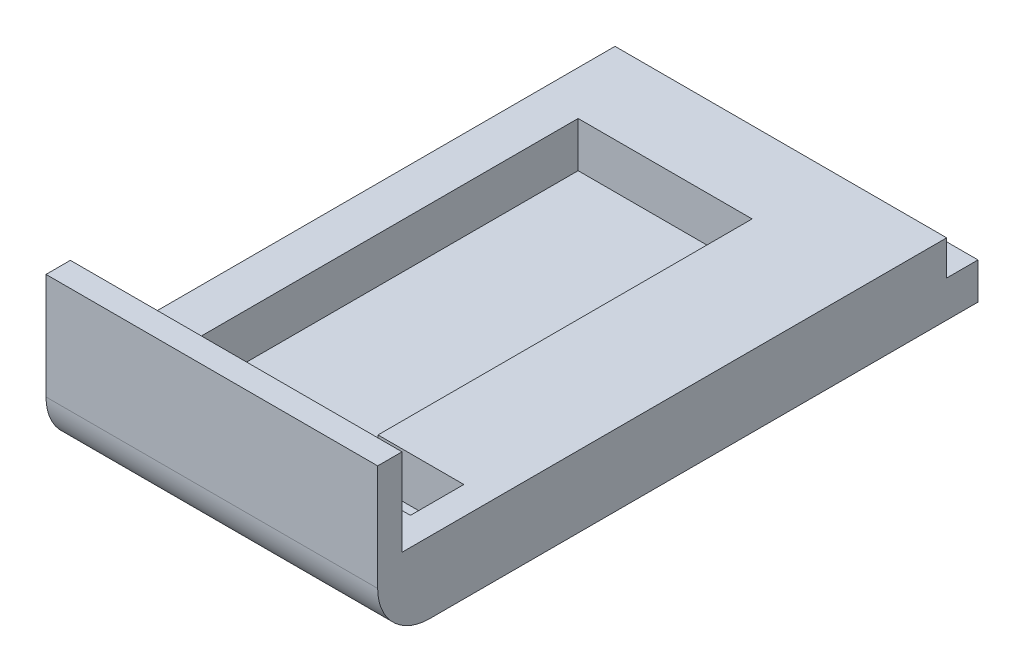
ISO-10303-21;
HEADER;
FILE_DESCRIPTION(('STEP AP214'),'2;1');
FILE_NAME('part.step','',(''),(''),'','','');
FILE_SCHEMA(('AUTOMOTIVE_DESIGN { 1 0 10303 214 1 1 1 1 }'));
ENDSEC;
DATA;
#1=APPLICATION_CONTEXT('core data for automotive mechanical design processes');
#2=APPLICATION_PROTOCOL_DEFINITION('international standard','automotive_design',2000,#1);
#3=PRODUCT_CONTEXT('',#1,'mechanical');
#4=PRODUCT('Part','Part','',(#3));
#5=PRODUCT_RELATED_PRODUCT_CATEGORY('part','',(#4));
#6=PRODUCT_DEFINITION_FORMATION('','',#4);
#7=PRODUCT_DEFINITION_CONTEXT('part definition',#1,'design');
#8=PRODUCT_DEFINITION('design','',#6,#7);
#9=PRODUCT_DEFINITION_SHAPE('','',#8);
#10=(LENGTH_UNIT() NAMED_UNIT(*) SI_UNIT(.MILLI.,.METRE.));
#11=(NAMED_UNIT(*) PLANE_ANGLE_UNIT() SI_UNIT($,.RADIAN.));
#12=(NAMED_UNIT(*) SI_UNIT($,.STERADIAN.) SOLID_ANGLE_UNIT());
#13=UNCERTAINTY_MEASURE_WITH_UNIT(LENGTH_MEASURE(1.E-05),#10,'distance_accuracy_value','');
#14=(GEOMETRIC_REPRESENTATION_CONTEXT(3) GLOBAL_UNCERTAINTY_ASSIGNED_CONTEXT((#13)) GLOBAL_UNIT_ASSIGNED_CONTEXT((#10,
#11,#12)) REPRESENTATION_CONTEXT('',''));
#15=CARTESIAN_POINT('',(0.,0.,0.));
#16=DIRECTION('',(0.,0.,1.));
#17=DIRECTION('',(1.,0.,0.));
#18=AXIS2_PLACEMENT_3D('',#15,#16,#17);
#19=CARTESIAN_POINT('',(19.06,0.,-34.5));
#20=DIRECTION('',(0.,-1.,0.));
#21=DIRECTION('',(0.,0.,-1.));
#22=AXIS2_PLACEMENT_3D('',#19,#20,#21);
#23=PLANE('',#22);
#24=DIRECTION('',(1.,0.,0.));
#25=VECTOR('',#24,1.);
#26=CARTESIAN_POINT('',(2.53,0.,-4.05));
#27=LINE('',#26,#25);
#28=CARTESIAN_POINT('',(2.53,0.,-4.05));
#29=VERTEX_POINT('',#28);
#30=CARTESIAN_POINT('',(11.9779181362568,0.,-4.05));
#31=VERTEX_POINT('',#30);
#32=EDGE_CURVE('E260',#29,#31,#27,.T.);
#33=ORIENTED_EDGE('',*,*,#32,.F.);
#34=DIRECTION('',(0.,0.,1.));
#35=VECTOR('',#34,1.);
#36=CARTESIAN_POINT('',(2.53,0.,-28.05));
#37=LINE('',#36,#35);
#38=CARTESIAN_POINT('',(2.53,0.,-28.05));
#39=VERTEX_POINT('',#38);
#40=EDGE_CURVE('E225',#39,#29,#37,.T.);
#41=ORIENTED_EDGE('',*,*,#40,.F.);
#42=DIRECTION('',(-1.,0.,0.));
#43=VECTOR('',#42,1.);
#44=CARTESIAN_POINT('',(2.53,0.,-28.05));
#45=LINE('',#44,#43);
#46=CARTESIAN_POINT('',(12.53,0.,-28.05));
#47=VERTEX_POINT('',#46);
#48=EDGE_CURVE('E231',#47,#39,#45,.T.);
#49=ORIENTED_EDGE('',*,*,#48,.F.);
#50=DIRECTION('',(0.,0.,-1.));
#51=VECTOR('',#50,1.);
#52=CARTESIAN_POINT('',(12.53,0.,-28.05));
#53=LINE('',#52,#51);
#54=CARTESIAN_POINT('',(12.53,0.,-6.55));
#55=VERTEX_POINT('',#54);
#56=EDGE_CURVE('E280',#55,#47,#53,.T.);
#57=ORIENTED_EDGE('',*,*,#56,.F.);
#58=DIRECTION('',(-1.,0.,0.));
#59=VECTOR('',#58,1.);
#60=CARTESIAN_POINT('',(12.53,0.,-6.55));
#61=LINE('',#60,#59);
#62=CARTESIAN_POINT('',(17.4641994632339,0.,-6.55));
#63=VERTEX_POINT('',#62);
#64=EDGE_CURVE('E276',#63,#55,#61,.T.);
#65=ORIENTED_EDGE('',*,*,#64,.F.);
#66=DIRECTION('',(0.,0.,-1.));
#67=VECTOR('',#66,1.);
#68=CARTESIAN_POINT('',(17.4641994632339,0.,-6.55));
#69=LINE('',#68,#67);
#70=CARTESIAN_POINT('',(17.4641994632339,0.,-3.47901693670788));
#71=VERTEX_POINT('',#70);
#72=EDGE_CURVE('E272',#71,#63,#69,.T.);
#73=ORIENTED_EDGE('',*,*,#72,.F.);
#74=DIRECTION('',(1.,0.,0.));
#75=VECTOR('',#74,1.);
#76=CARTESIAN_POINT('',(12.53,0.,-3.47901693670788));
#77=LINE('',#76,#75);
#78=CARTESIAN_POINT('',(11.9779181362568,0.,-3.47901693670788));
#79=VERTEX_POINT('',#78);
#80=EDGE_CURVE('E268',#79,#71,#77,.T.);
#81=ORIENTED_EDGE('',*,*,#80,.F.);
#82=DIRECTION('',(0.,0.,1.));
#83=VECTOR('',#82,1.);
#84=CARTESIAN_POINT('',(11.9779181362568,0.,-3.47901693670788));
#85=LINE('',#84,#83);
#86=EDGE_CURVE('E264',#31,#79,#85,.T.);
#87=ORIENTED_EDGE('',*,*,#86,.F.);
#88=EDGE_LOOP('',(#33,#41,#49,#57,#65,#73,#81,#87));
#89=FACE_BOUND('',#88,.T.);
#90=DIRECTION('',(0.,0.,1.));
#91=VECTOR('',#90,1.);
#92=CARTESIAN_POINT('',(19.06,0.,-34.5));
#93=LINE('',#92,#91);
#94=CARTESIAN_POINT('',(19.06,0.,-32.7));
#95=VERTEX_POINT('',#94);
#96=CARTESIAN_POINT('',(19.06,0.,-1.40000000000002));
#97=VERTEX_POINT('',#96);
#98=EDGE_CURVE('E310',#95,#97,#93,.T.);
#99=ORIENTED_EDGE('',*,*,#98,.F.);
#100=DIRECTION('',(-1.,0.,0.));
#101=VECTOR('',#100,1.);
#102=CARTESIAN_POINT('',(19.061,0.,-32.7));
#103=LINE('',#102,#101);
#104=CARTESIAN_POINT('',(0.,0.,-32.7));
#105=VERTEX_POINT('',#104);
#106=EDGE_CURVE('E171',#95,#105,#103,.T.);
#107=ORIENTED_EDGE('',*,*,#106,.T.);
#108=DIRECTION('',(0.,0.,1.));
#109=VECTOR('',#108,1.);
#110=CARTESIAN_POINT('',(0.,0.,-34.5));
#111=LINE('',#110,#109);
#112=CARTESIAN_POINT('',(0.,0.,-1.40000000000002));
#113=VERTEX_POINT('',#112);
#114=EDGE_CURVE('E167',#105,#113,#111,.T.);
#115=ORIENTED_EDGE('',*,*,#114,.T.);
#116=DIRECTION('',(1.,0.,0.));
#117=VECTOR('',#116,1.);
#118=CARTESIAN_POINT('',(0.,0.,-1.40000000000002));
#119=LINE('',#118,#117);
#120=EDGE_CURVE('E169',#113,#97,#119,.T.);
#121=ORIENTED_EDGE('',*,*,#120,.T.);
#122=EDGE_LOOP('',(#99,#107,#115,#121));
#123=FACE_BOUND('',#122,.T.);
#124=ADVANCED_FACE('F45',(#89,#123),#23,.F.);
#125=CARTESIAN_POINT('',(19.06,0.,0.));
#126=DIRECTION('',(0.,0.,-1.));
#127=DIRECTION('',(0.,1.,0.));
#128=AXIS2_PLACEMENT_3D('',#125,#126,#127);
#129=PLANE('',#128);
#130=DIRECTION('',(0.,-1.,0.));
#131=VECTOR('',#130,1.);
#132=CARTESIAN_POINT('',(0.,0.,0.));
#133=LINE('',#132,#131);
#134=CARTESIAN_POINT('',(0.,5.,0.));
#135=VERTEX_POINT('',#134);
#136=CARTESIAN_POINT('',(0.,-1.09999999999998,0.));
#137=VERTEX_POINT('',#136);
#138=EDGE_CURVE('E175',#135,#137,#133,.T.);
#139=ORIENTED_EDGE('',*,*,#138,.T.);
#140=DIRECTION('',(-1.,0.,0.));
#141=VECTOR('',#140,1.);
#142=CARTESIAN_POINT('',(19.06,-1.09999999999998,0.));
#143=LINE('',#142,#141);
#144=CARTESIAN_POINT('',(19.06,-1.09999999999998,0.));
#145=VERTEX_POINT('',#144);
#146=EDGE_CURVE('E11',#145,#137,#143,.T.);
#147=ORIENTED_EDGE('',*,*,#146,.F.);
#148=DIRECTION('',(0.,-1.,0.));
#149=VECTOR('',#148,1.);
#150=CARTESIAN_POINT('',(19.06,0.,0.));
#151=LINE('',#150,#149);
#152=CARTESIAN_POINT('',(19.06,5.,0.));
#153=VERTEX_POINT('',#152);
#154=EDGE_CURVE('E313',#153,#145,#151,.T.);
#155=ORIENTED_EDGE('',*,*,#154,.F.);
#156=DIRECTION('',(1.,0.,0.));
#157=VECTOR('',#156,1.);
#158=CARTESIAN_POINT('',(19.06,5.,0.));
#159=LINE('',#158,#157);
#160=EDGE_CURVE('E221',#135,#153,#159,.T.);
#161=ORIENTED_EDGE('',*,*,#160,.F.);
#162=EDGE_LOOP('',(#139,#147,#155,#161));
#163=FACE_BOUND('',#162,.T.);
#164=ADVANCED_FACE('F364',(#163),#129,.F.);
#165=CARTESIAN_POINT('',(19.06,-1.1,-3.));
#166=DIRECTION('',(-1.,0.,0.));
#167=DIRECTION('',(0.,0.,1.));
#168=AXIS2_PLACEMENT_3D('',#165,#166,#167);
#169=CYLINDRICAL_SURFACE('',#168,3.);
#170=CARTESIAN_POINT('',(0.,-1.1,-3.));
#171=DIRECTION('',(1.,0.,0.));
#172=DIRECTION('',(0.,0.,1.));
#173=AXIS2_PLACEMENT_3D('',#170,#171,#172);
#174=CIRCLE('',#173,3.);
#175=CARTESIAN_POINT('',(0.,-4.1,-3.00000000000002));
#176=VERTEX_POINT('',#175);
#177=EDGE_CURVE('E330',#137,#176,#174,.T.);
#178=ORIENTED_EDGE('',*,*,#177,.T.);
#179=DIRECTION('',(-1.,0.,0.));
#180=VECTOR('',#179,1.);
#181=CARTESIAN_POINT('',(19.06,-4.1,-3.00000000000002));
#182=LINE('',#181,#180);
#183=CARTESIAN_POINT('',(19.06,-4.1,-3.00000000000002));
#184=VERTEX_POINT('',#183);
#185=EDGE_CURVE('E53',#184,#176,#182,.T.);
#186=ORIENTED_EDGE('',*,*,#185,.F.);
#187=CARTESIAN_POINT('',(19.06,-1.1,-3.));
#188=DIRECTION('',(1.,0.,0.));
#189=DIRECTION('',(0.,0.,1.));
#190=AXIS2_PLACEMENT_3D('',#187,#188,#189);
#191=CIRCLE('',#190,3.);
#192=EDGE_CURVE('E317',#145,#184,#191,.T.);
#193=ORIENTED_EDGE('',*,*,#192,.F.);
#194=ORIENTED_EDGE('',*,*,#146,.T.);
#195=EDGE_LOOP('',(#178,#186,#193,#194));
#196=FACE_BOUND('',#195,.T.);
#197=ADVANCED_FACE('F362',(#196),#169,.T.);
#198=CARTESIAN_POINT('',(19.06,-4.1,-3.00000000000002));
#199=DIRECTION('',(0.,1.,0.));
#200=DIRECTION('',(0.,0.,1.));
#201=AXIS2_PLACEMENT_3D('',#198,#199,#200);
#202=PLANE('',#201);
#203=DIRECTION('',(0.,0.,-1.));
#204=VECTOR('',#203,1.);
#205=CARTESIAN_POINT('',(0.,-4.1,-3.00000000000002));
#206=LINE('',#205,#204);
#207=CARTESIAN_POINT('',(0.,-4.1,-34.5));
#208=VERTEX_POINT('',#207);
#209=EDGE_CURVE('E333',#176,#208,#206,.T.);
#210=ORIENTED_EDGE('',*,*,#209,.T.);
#211=DIRECTION('',(-1.,0.,0.));
#212=VECTOR('',#211,1.);
#213=CARTESIAN_POINT('',(19.06,-4.1,-34.5));
#214=LINE('',#213,#212);
#215=CARTESIAN_POINT('',(19.06,-4.1,-34.5));
#216=VERTEX_POINT('',#215);
#217=EDGE_CURVE('E326',#216,#208,#214,.T.);
#218=ORIENTED_EDGE('',*,*,#217,.F.);
#219=DIRECTION('',(0.,0.,-1.));
#220=VECTOR('',#219,1.);
#221=CARTESIAN_POINT('',(19.06,-4.1,-3.00000000000002));
#222=LINE('',#221,#220);
#223=EDGE_CURVE('E320',#184,#216,#222,.T.);
#224=ORIENTED_EDGE('',*,*,#223,.F.);
#225=ORIENTED_EDGE('',*,*,#185,.T.);
#226=EDGE_LOOP('',(#210,#218,#224,#225));
#227=FACE_BOUND('',#226,.T.);
#228=ADVANCED_FACE('F347',(#227),#202,.F.);
#229=CARTESIAN_POINT('',(19.06,-4.1,-34.5));
#230=DIRECTION('',(0.,0.,1.));
#231=DIRECTION('',(1.,0.,0.));
#232=AXIS2_PLACEMENT_3D('',#229,#230,#231);
#233=PLANE('',#232);
#234=DIRECTION('',(0.,1.,0.));
#235=VECTOR('',#234,1.);
#236=CARTESIAN_POINT('',(0.,-4.1,-34.5));
#237=LINE('',#236,#235);
#238=CARTESIAN_POINT('',(0.,-2.,-34.5));
#239=VERTEX_POINT('',#238);
#240=EDGE_CURVE('E314',#208,#239,#237,.T.);
#241=ORIENTED_EDGE('',*,*,#240,.T.);
#242=DIRECTION('',(-1.,0.,0.));
#243=VECTOR('',#242,1.);
#244=CARTESIAN_POINT('',(19.061,-2.,-34.5));
#245=LINE('',#244,#243);
#246=CARTESIAN_POINT('',(19.06,-2.,-34.5));
#247=VERTEX_POINT('',#246);
#248=EDGE_CURVE('E68',#247,#239,#245,.T.);
#249=ORIENTED_EDGE('',*,*,#248,.F.);
#250=DIRECTION('',(0.,1.,0.));
#251=VECTOR('',#250,1.);
#252=CARTESIAN_POINT('',(19.06,-4.1,-34.5));
#253=LINE('',#252,#251);
#254=EDGE_CURVE('E323',#216,#247,#253,.T.);
#255=ORIENTED_EDGE('',*,*,#254,.F.);
#256=ORIENTED_EDGE('',*,*,#217,.T.);
#257=EDGE_LOOP('',(#241,#249,#255,#256));
#258=FACE_BOUND('',#257,.T.);
#259=ADVANCED_FACE('F354',(#258),#233,.F.);
#260=CARTESIAN_POINT('',(19.06,-1.1,-3.));
#261=DIRECTION('',(-1.,0.,0.));
#262=DIRECTION('',(0.,0.,1.));
#263=AXIS2_PLACEMENT_3D('',#260,#261,#262);
#264=PLANE('',#263);
#265=ORIENTED_EDGE('',*,*,#98,.T.);
#266=DIRECTION('',(0.,-1.,0.));
#267=VECTOR('',#266,1.);
#268=CARTESIAN_POINT('',(19.06,0.,-1.40000000000002));
#269=LINE('',#268,#267);
#270=CARTESIAN_POINT('',(19.06,5.,-1.40000000000002));
#271=VERTEX_POINT('',#270);
#272=EDGE_CURVE('E180',#271,#97,#269,.T.);
#273=ORIENTED_EDGE('',*,*,#272,.F.);
#274=DIRECTION('',(0.,0.,-1.));
#275=VECTOR('',#274,1.);
#276=CARTESIAN_POINT('',(19.06,5.,-1.90000000000002));
#277=LINE('',#276,#275);
#278=EDGE_CURVE('E215',#153,#271,#277,.T.);
#279=ORIENTED_EDGE('',*,*,#278,.F.);
#280=ORIENTED_EDGE('',*,*,#154,.T.);
#281=ORIENTED_EDGE('',*,*,#192,.T.);
#282=ORIENTED_EDGE('',*,*,#223,.T.);
#283=ORIENTED_EDGE('',*,*,#254,.T.);
#284=DIRECTION('',(0.,0.,-1.));
#285=VECTOR('',#284,1.);
#286=CARTESIAN_POINT('',(19.06,-2.,-34.5));
#287=LINE('',#286,#285);
#288=CARTESIAN_POINT('',(19.06,-2.,-32.7));
#289=VERTEX_POINT('',#288);
#290=EDGE_CURVE('E207',#289,#247,#287,.T.);
#291=ORIENTED_EDGE('',*,*,#290,.F.);
#292=DIRECTION('',(0.,-1.,0.));
#293=VECTOR('',#292,1.);
#294=CARTESIAN_POINT('',(19.06,0.,-32.7));
#295=LINE('',#294,#293);
#296=EDGE_CURVE('E182',#95,#289,#295,.T.);
#297=ORIENTED_EDGE('',*,*,#296,.F.);
#298=EDGE_LOOP('',(#265,#273,#279,#280,#281,#282,#283,#291,#297));
#299=FACE_BOUND('',#298,.T.);
#300=ADVANCED_FACE('F358',(#299),#264,.F.);
#301=CARTESIAN_POINT('',(0.,-1.1,-3.));
#302=DIRECTION('',(-1.,0.,0.));
#303=DIRECTION('',(0.,0.,1.));
#304=AXIS2_PLACEMENT_3D('',#301,#302,#303);
#305=PLANE('',#304);
#306=DIRECTION('',(0.,-1.,0.));
#307=VECTOR('',#306,1.);
#308=CARTESIAN_POINT('',(0.,0.,-1.40000000000002));
#309=LINE('',#308,#307);
#310=CARTESIAN_POINT('',(0.,5.,-1.40000000000002));
#311=VERTEX_POINT('',#310);
#312=EDGE_CURVE('E60',#311,#113,#309,.T.);
#313=ORIENTED_EDGE('',*,*,#312,.T.);
#314=ORIENTED_EDGE('',*,*,#114,.F.);
#315=DIRECTION('',(0.,1.,0.));
#316=VECTOR('',#315,1.);
#317=CARTESIAN_POINT('',(0.,0.,-32.7));
#318=LINE('',#317,#316);
#319=CARTESIAN_POINT('',(0.,-2.,-32.7));
#320=VERTEX_POINT('',#319);
#321=EDGE_CURVE('E202',#320,#105,#318,.T.);
#322=ORIENTED_EDGE('',*,*,#321,.F.);
#323=DIRECTION('',(0.,0.,1.));
#324=VECTOR('',#323,1.);
#325=CARTESIAN_POINT('',(0.,-2.,-34.5));
#326=LINE('',#325,#324);
#327=EDGE_CURVE('E199',#239,#320,#326,.T.);
#328=ORIENTED_EDGE('',*,*,#327,.F.);
#329=ORIENTED_EDGE('',*,*,#240,.F.);
#330=ORIENTED_EDGE('',*,*,#209,.F.);
#331=ORIENTED_EDGE('',*,*,#177,.F.);
#332=ORIENTED_EDGE('',*,*,#138,.F.);
#333=DIRECTION('',(0.,0.,1.));
#334=VECTOR('',#333,1.);
#335=CARTESIAN_POINT('',(0.,5.,-1.90000000000002));
#336=LINE('',#335,#334);
#337=EDGE_CURVE('E188',#311,#135,#336,.T.);
#338=ORIENTED_EDGE('',*,*,#337,.F.);
#339=EDGE_LOOP('',(#313,#314,#322,#328,#329,#330,#331,#332,#338));
#340=FACE_BOUND('',#339,.T.);
#341=ADVANCED_FACE('F186',(#340),#305,.T.);
#342=CARTESIAN_POINT('',(2.53,-2.6,-28.05));
#343=DIRECTION('',(-1.,0.,0.));
#344=DIRECTION('',(0.,0.,1.));
#345=AXIS2_PLACEMENT_3D('',#342,#343,#344);
#346=PLANE('',#345);
#347=ORIENTED_EDGE('',*,*,#40,.T.);
#348=DIRECTION('',(0.,1.,0.));
#349=VECTOR('',#348,1.);
#350=CARTESIAN_POINT('',(2.53,-2.6,-4.05));
#351=LINE('',#350,#349);
#352=CARTESIAN_POINT('',(2.53,-2.6,-4.05));
#353=VERTEX_POINT('',#352);
#354=EDGE_CURVE('E257',#353,#29,#351,.T.);
#355=ORIENTED_EDGE('',*,*,#354,.F.);
#356=DIRECTION('',(0.,0.,1.));
#357=VECTOR('',#356,1.);
#358=CARTESIAN_POINT('',(2.53,-2.6,-28.05));
#359=LINE('',#358,#357);
#360=CARTESIAN_POINT('',(2.53,-2.6,-28.05));
#361=VERTEX_POINT('',#360);
#362=EDGE_CURVE('E226',#361,#353,#359,.T.);
#363=ORIENTED_EDGE('',*,*,#362,.F.);
#364=DIRECTION('',(0.,1.,0.));
#365=VECTOR('',#364,1.);
#366=CARTESIAN_POINT('',(2.53,-2.6,-28.05));
#367=LINE('',#366,#365);
#368=EDGE_CURVE('E176',#361,#39,#367,.T.);
#369=ORIENTED_EDGE('',*,*,#368,.T.);
#370=EDGE_LOOP('',(#347,#355,#363,#369));
#371=FACE_BOUND('',#370,.T.);
#372=ADVANCED_FACE('F397',(#371),#346,.F.);
#373=CARTESIAN_POINT('',(2.53,-2.6,-28.05));
#374=DIRECTION('',(0.,0.,-1.));
#375=DIRECTION('',(-1.,0.,0.));
#376=AXIS2_PLACEMENT_3D('',#373,#374,#375);
#377=PLANE('',#376);
#378=ORIENTED_EDGE('',*,*,#48,.T.);
#379=ORIENTED_EDGE('',*,*,#368,.F.);
#380=DIRECTION('',(-1.,0.,0.));
#381=VECTOR('',#380,1.);
#382=CARTESIAN_POINT('',(2.53,-2.6,-28.05));
#383=LINE('',#382,#381);
#384=CARTESIAN_POINT('',(12.53,-2.6,-28.05));
#385=VERTEX_POINT('',#384);
#386=EDGE_CURVE('E253',#385,#361,#383,.T.);
#387=ORIENTED_EDGE('',*,*,#386,.F.);
#388=DIRECTION('',(0.,1.,0.));
#389=VECTOR('',#388,1.);
#390=CARTESIAN_POINT('',(12.53,-2.6,-28.05));
#391=LINE('',#390,#389);
#392=EDGE_CURVE('E289',#385,#47,#391,.T.);
#393=ORIENTED_EDGE('',*,*,#392,.T.);
#394=EDGE_LOOP('',(#378,#379,#387,#393));
#395=FACE_BOUND('',#394,.T.);
#396=ADVANCED_FACE('F400',(#395),#377,.F.);
#397=CARTESIAN_POINT('',(12.53,-2.6,-28.05));
#398=DIRECTION('',(1.,0.,0.));
#399=DIRECTION('',(0.,0.,-1.));
#400=AXIS2_PLACEMENT_3D('',#397,#398,#399);
#401=PLANE('',#400);
#402=ORIENTED_EDGE('',*,*,#56,.T.);
#403=ORIENTED_EDGE('',*,*,#392,.F.);
#404=DIRECTION('',(0.,0.,-1.));
#405=VECTOR('',#404,1.);
#406=CARTESIAN_POINT('',(12.53,-2.6,-28.05));
#407=LINE('',#406,#405);
#408=CARTESIAN_POINT('',(12.53,-2.6,-6.55));
#409=VERTEX_POINT('',#408);
#410=EDGE_CURVE('E249',#409,#385,#407,.T.);
#411=ORIENTED_EDGE('',*,*,#410,.F.);
#412=DIRECTION('',(0.,1.,0.));
#413=VECTOR('',#412,1.);
#414=CARTESIAN_POINT('',(12.53,-2.6,-6.55));
#415=LINE('',#414,#413);
#416=EDGE_CURVE('E292',#409,#55,#415,.T.);
#417=ORIENTED_EDGE('',*,*,#416,.T.);
#418=EDGE_LOOP('',(#402,#403,#411,#417));
#419=FACE_BOUND('',#418,.T.);
#420=ADVANCED_FACE('F405',(#419),#401,.F.);
#421=CARTESIAN_POINT('',(12.53,-2.6,-6.55));
#422=DIRECTION('',(0.,0.,-1.));
#423=DIRECTION('',(-1.,0.,0.));
#424=AXIS2_PLACEMENT_3D('',#421,#422,#423);
#425=PLANE('',#424);
#426=ORIENTED_EDGE('',*,*,#64,.T.);
#427=ORIENTED_EDGE('',*,*,#416,.F.);
#428=DIRECTION('',(-1.,0.,0.));
#429=VECTOR('',#428,1.);
#430=CARTESIAN_POINT('',(12.53,-2.6,-6.55));
#431=LINE('',#430,#429);
#432=CARTESIAN_POINT('',(17.4641994632339,-2.6,-6.55));
#433=VERTEX_POINT('',#432);
#434=EDGE_CURVE('E245',#433,#409,#431,.T.);
#435=ORIENTED_EDGE('',*,*,#434,.F.);
#436=DIRECTION('',(0.,1.,0.));
#437=VECTOR('',#436,1.);
#438=CARTESIAN_POINT('',(17.4641994632339,-2.6,-6.55));
#439=LINE('',#438,#437);
#440=EDGE_CURVE('E295',#433,#63,#439,.T.);
#441=ORIENTED_EDGE('',*,*,#440,.T.);
#442=EDGE_LOOP('',(#426,#427,#435,#441));
#443=FACE_BOUND('',#442,.T.);
#444=ADVANCED_FACE('F409',(#443),#425,.F.);
#445=CARTESIAN_POINT('',(17.4641994632339,-2.6,-6.55));
#446=DIRECTION('',(1.,0.,0.));
#447=DIRECTION('',(0.,0.,-1.));
#448=AXIS2_PLACEMENT_3D('',#445,#446,#447);
#449=PLANE('',#448);
#450=ORIENTED_EDGE('',*,*,#72,.T.);
#451=ORIENTED_EDGE('',*,*,#440,.F.);
#452=DIRECTION('',(0.,0.,-1.));
#453=VECTOR('',#452,1.);
#454=CARTESIAN_POINT('',(17.4641994632339,-2.6,-3.47901693670788));
#455=LINE('',#454,#453);
#456=CARTESIAN_POINT('',(17.4641994632339,-2.6,-3.47901693670788));
#457=VERTEX_POINT('',#456);
#458=EDGE_CURVE('E242',#457,#433,#455,.T.);
#459=ORIENTED_EDGE('',*,*,#458,.F.);
#460=DIRECTION('',(0.,1.,0.));
#461=VECTOR('',#460,1.);
#462=CARTESIAN_POINT('',(17.4641994632339,-2.6,-3.47901693670788));
#463=LINE('',#462,#461);
#464=EDGE_CURVE('E298',#457,#71,#463,.T.);
#465=ORIENTED_EDGE('',*,*,#464,.T.);
#466=EDGE_LOOP('',(#450,#451,#459,#465));
#467=FACE_BOUND('',#466,.T.);
#468=ADVANCED_FACE('F413',(#467),#449,.F.);
#469=CARTESIAN_POINT('',(12.53,-2.6,-3.47901693670788));
#470=DIRECTION('',(0.,0.,1.));
#471=DIRECTION('',(1.,0.,0.));
#472=AXIS2_PLACEMENT_3D('',#469,#470,#471);
#473=PLANE('',#472);
#474=ORIENTED_EDGE('',*,*,#80,.T.);
#475=ORIENTED_EDGE('',*,*,#464,.F.);
#476=DIRECTION('',(1.,0.,0.));
#477=VECTOR('',#476,1.);
#478=CARTESIAN_POINT('',(12.53,-2.6,-3.47901693670788));
#479=LINE('',#478,#477);
#480=CARTESIAN_POINT('',(11.9779181362568,-2.6,-3.47901693670788));
#481=VERTEX_POINT('',#480);
#482=EDGE_CURVE('E239',#481,#457,#479,.T.);
#483=ORIENTED_EDGE('',*,*,#482,.F.);
#484=DIRECTION('',(0.,1.,0.));
#485=VECTOR('',#484,1.);
#486=CARTESIAN_POINT('',(11.9779181362568,-2.6,-3.47901693670788));
#487=LINE('',#486,#485);
#488=EDGE_CURVE('E301',#481,#79,#487,.T.);
#489=ORIENTED_EDGE('',*,*,#488,.T.);
#490=EDGE_LOOP('',(#474,#475,#483,#489));
#491=FACE_BOUND('',#490,.T.);
#492=ADVANCED_FACE('F416',(#491),#473,.F.);
#493=CARTESIAN_POINT('',(11.9779181362568,-2.6,-3.47901693670788));
#494=DIRECTION('',(-1.,0.,0.));
#495=DIRECTION('',(0.,0.,1.));
#496=AXIS2_PLACEMENT_3D('',#493,#494,#495);
#497=PLANE('',#496);
#498=ORIENTED_EDGE('',*,*,#86,.T.);
#499=ORIENTED_EDGE('',*,*,#488,.F.);
#500=DIRECTION('',(0.,0.,1.));
#501=VECTOR('',#500,1.);
#502=CARTESIAN_POINT('',(11.9779181362568,-2.6,-3.47901693670788));
#503=LINE('',#502,#501);
#504=CARTESIAN_POINT('',(11.9779181362568,-2.6,-4.05));
#505=VERTEX_POINT('',#504);
#506=EDGE_CURVE('E235',#505,#481,#503,.T.);
#507=ORIENTED_EDGE('',*,*,#506,.F.);
#508=DIRECTION('',(0.,1.,0.));
#509=VECTOR('',#508,1.);
#510=CARTESIAN_POINT('',(11.9779181362568,-2.6,-4.05));
#511=LINE('',#510,#509);
#512=EDGE_CURVE('E304',#505,#31,#511,.T.);
#513=ORIENTED_EDGE('',*,*,#512,.T.);
#514=EDGE_LOOP('',(#498,#499,#507,#513));
#515=FACE_BOUND('',#514,.T.);
#516=ADVANCED_FACE('F419',(#515),#497,.F.);
#517=CARTESIAN_POINT('',(2.53,-2.6,-4.05));
#518=DIRECTION('',(0.,0.,1.));
#519=DIRECTION('',(1.,0.,0.));
#520=AXIS2_PLACEMENT_3D('',#517,#518,#519);
#521=PLANE('',#520);
#522=ORIENTED_EDGE('',*,*,#32,.T.);
#523=ORIENTED_EDGE('',*,*,#512,.F.);
#524=DIRECTION('',(1.,0.,0.));
#525=VECTOR('',#524,1.);
#526=CARTESIAN_POINT('',(2.53,-2.6,-4.05));
#527=LINE('',#526,#525);
#528=EDGE_CURVE('E230',#353,#505,#527,.T.);
#529=ORIENTED_EDGE('',*,*,#528,.F.);
#530=ORIENTED_EDGE('',*,*,#354,.T.);
#531=EDGE_LOOP('',(#522,#523,#529,#530));
#532=FACE_BOUND('',#531,.T.);
#533=ADVANCED_FACE('F392',(#532),#521,.F.);
#534=CARTESIAN_POINT('',(0.,-2.6,0.));
#535=DIRECTION('',(0.,1.,0.));
#536=DIRECTION('',(0.,0.,1.));
#537=AXIS2_PLACEMENT_3D('',#534,#535,#536);
#538=PLANE('',#537);
#539=ORIENTED_EDGE('',*,*,#362,.T.);
#540=ORIENTED_EDGE('',*,*,#528,.T.);
#541=ORIENTED_EDGE('',*,*,#506,.T.);
#542=ORIENTED_EDGE('',*,*,#482,.T.);
#543=ORIENTED_EDGE('',*,*,#458,.T.);
#544=ORIENTED_EDGE('',*,*,#434,.T.);
#545=ORIENTED_EDGE('',*,*,#410,.T.);
#546=ORIENTED_EDGE('',*,*,#386,.T.);
#547=EDGE_LOOP('',(#539,#540,#541,#542,#543,#544,#545,#546));
#548=FACE_BOUND('',#547,.T.);
#549=ADVANCED_FACE('F421',(#548),#538,.T.);
#550=CARTESIAN_POINT('',(0.,5.,0.));
#551=DIRECTION('',(0.,-1.,0.));
#552=DIRECTION('',(0.,0.,-1.));
#553=AXIS2_PLACEMENT_3D('',#550,#551,#552);
#554=PLANE('',#553);
#555=ORIENTED_EDGE('',*,*,#278,.T.);
#556=DIRECTION('',(1.,0.,0.));
#557=VECTOR('',#556,1.);
#558=CARTESIAN_POINT('',(0.,5.,-1.40000000000002));
#559=LINE('',#558,#557);
#560=EDGE_CURVE('E183',#311,#271,#559,.T.);
#561=ORIENTED_EDGE('',*,*,#560,.F.);
#562=ORIENTED_EDGE('',*,*,#337,.T.);
#563=ORIENTED_EDGE('',*,*,#160,.T.);
#564=EDGE_LOOP('',(#555,#561,#562,#563));
#565=FACE_BOUND('',#564,.T.);
#566=ADVANCED_FACE('F367',(#565),#554,.F.);
#567=CARTESIAN_POINT('',(19.061,0.,-32.7));
#568=DIRECTION('',(0.,0.,1.));
#569=DIRECTION('',(1.,0.,0.));
#570=AXIS2_PLACEMENT_3D('',#567,#568,#569);
#571=PLANE('',#570);
#572=ORIENTED_EDGE('',*,*,#296,.T.);
#573=DIRECTION('',(-1.,0.,0.));
#574=VECTOR('',#573,1.);
#575=CARTESIAN_POINT('',(19.061,-2.,-32.7));
#576=LINE('',#575,#574);
#577=EDGE_CURVE('E208',#289,#320,#576,.T.);
#578=ORIENTED_EDGE('',*,*,#577,.T.);
#579=ORIENTED_EDGE('',*,*,#321,.T.);
#580=ORIENTED_EDGE('',*,*,#106,.F.);
#581=EDGE_LOOP('',(#572,#578,#579,#580));
#582=FACE_BOUND('',#581,.T.);
#583=ADVANCED_FACE('F369',(#582),#571,.F.);
#584=CARTESIAN_POINT('',(19.061,-2.,-34.5));
#585=DIRECTION('',(0.,-1.,0.));
#586=DIRECTION('',(0.,0.,-1.));
#587=AXIS2_PLACEMENT_3D('',#584,#585,#586);
#588=PLANE('',#587);
#589=ORIENTED_EDGE('',*,*,#290,.T.);
#590=ORIENTED_EDGE('',*,*,#248,.T.);
#591=ORIENTED_EDGE('',*,*,#327,.T.);
#592=ORIENTED_EDGE('',*,*,#577,.F.);
#593=EDGE_LOOP('',(#589,#590,#591,#592));
#594=FACE_BOUND('',#593,.T.);
#595=ADVANCED_FACE('F370',(#594),#588,.F.);
#596=CARTESIAN_POINT('',(0.,0.,-1.40000000000002));
#597=DIRECTION('',(0.,0.,1.));
#598=DIRECTION('',(1.,0.,0.));
#599=AXIS2_PLACEMENT_3D('',#596,#597,#598);
#600=PLANE('',#599);
#601=ORIENTED_EDGE('',*,*,#272,.T.);
#602=ORIENTED_EDGE('',*,*,#120,.F.);
#603=ORIENTED_EDGE('',*,*,#312,.F.);
#604=ORIENTED_EDGE('',*,*,#560,.T.);
#605=EDGE_LOOP('',(#601,#602,#603,#604));
#606=FACE_BOUND('',#605,.T.);
#607=ADVANCED_FACE('F178',(#606),#600,.F.);
#608=CLOSED_SHELL('',(#124,#164,#197,#228,#259,#300,#341,#372,#396,#420,#444,#468,#492,#516,
#533,#549,#566,#583,#595,#607));
#609=MANIFOLD_SOLID_BREP('B2',#608);
#610=ADVANCED_BREP_SHAPE_REPRESENTATION('',(#18,#609),#14);
#611=SHAPE_DEFINITION_REPRESENTATION(#9,#610);
ENDSEC;
END-ISO-10303-21;
